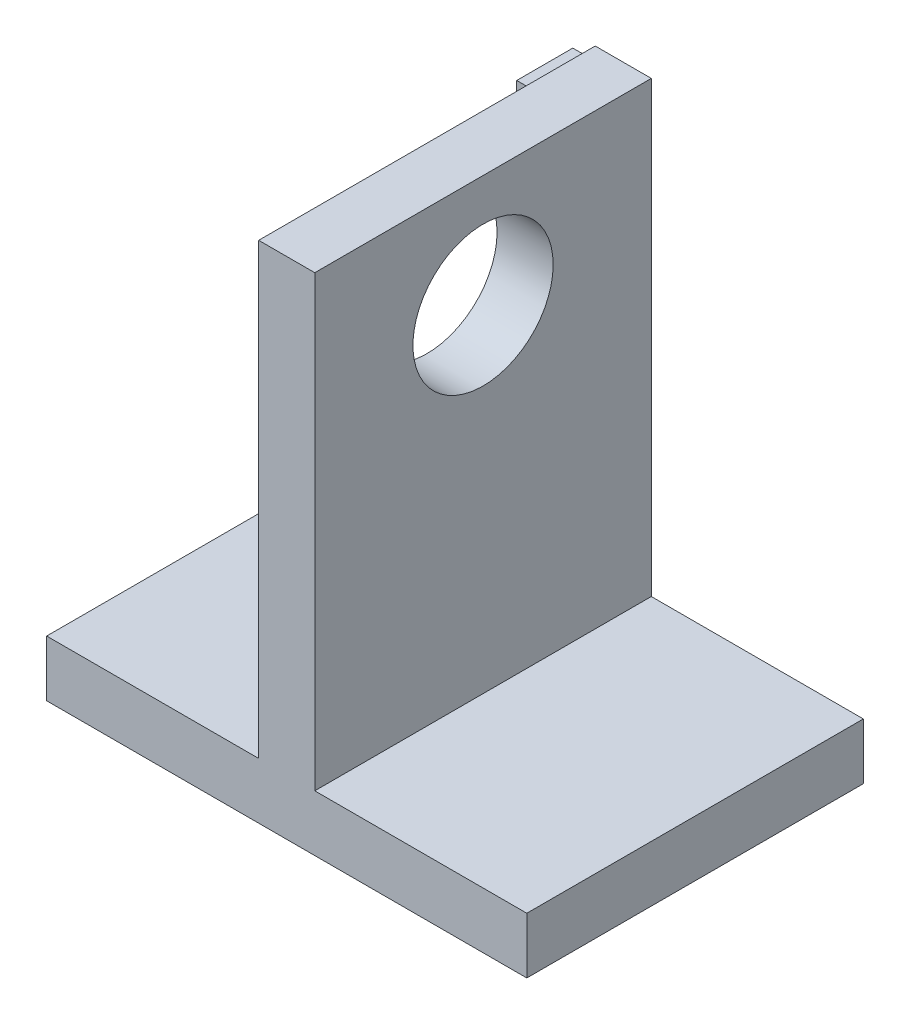
ISO-10303-21;
HEADER;
FILE_DESCRIPTION(('STEP AP214'),'2;1');
FILE_NAME('part.step','',(''),(''),'','','');
FILE_SCHEMA(('AUTOMOTIVE_DESIGN { 1 0 10303 214 1 1 1 1 }'));
ENDSEC;
DATA;
#1=APPLICATION_CONTEXT('core data for automotive mechanical design processes');
#2=APPLICATION_PROTOCOL_DEFINITION('international standard','automotive_design',2000,#1);
#3=PRODUCT_CONTEXT('',#1,'mechanical');
#4=PRODUCT('Part','Part','',(#3));
#5=PRODUCT_RELATED_PRODUCT_CATEGORY('part','',(#4));
#6=PRODUCT_DEFINITION_FORMATION('','',#4);
#7=PRODUCT_DEFINITION_CONTEXT('part definition',#1,'design');
#8=PRODUCT_DEFINITION('design','',#6,#7);
#9=PRODUCT_DEFINITION_SHAPE('','',#8);
#10=(LENGTH_UNIT() NAMED_UNIT(*) SI_UNIT(.MILLI.,.METRE.));
#11=(NAMED_UNIT(*) PLANE_ANGLE_UNIT() SI_UNIT($,.RADIAN.));
#12=(NAMED_UNIT(*) SI_UNIT($,.STERADIAN.) SOLID_ANGLE_UNIT());
#13=UNCERTAINTY_MEASURE_WITH_UNIT(LENGTH_MEASURE(1.E-05),#10,'distance_accuracy_value','');
#14=(GEOMETRIC_REPRESENTATION_CONTEXT(3) GLOBAL_UNCERTAINTY_ASSIGNED_CONTEXT((#13)) GLOBAL_UNIT_ASSIGNED_CONTEXT((#10,
#11,#12)) REPRESENTATION_CONTEXT('',''));
#15=CARTESIAN_POINT('',(0.,0.,0.));
#16=DIRECTION('',(0.,0.,1.));
#17=DIRECTION('',(1.,0.,0.));
#18=AXIS2_PLACEMENT_3D('',#15,#16,#17);
#19=CARTESIAN_POINT('',(-1.39700000000001,3.175,19.05));
#20=DIRECTION('',(-1.,0.,0.));
#21=DIRECTION('',(0.,0.,1.));
#22=AXIS2_PLACEMENT_3D('',#19,#20,#21);
#23=PLANE('',#22);
#24=CARTESIAN_POINT('',(-1.39700000000001,41.275,0.));
#25=DIRECTION('',(-1.,0.,0.));
#26=DIRECTION('',(0.,0.,1.));
#27=AXIS2_PLACEMENT_3D('',#24,#25,#26);
#28=CIRCLE('',#27,7.9375);
#29=CARTESIAN_POINT('',(-1.39700000000001,41.275,-7.9375));
#30=VERTEX_POINT('',#29);
#31=EDGE_CURVE('E206',#30,#30,#28,.T.);
#32=ORIENTED_EDGE('',*,*,#31,.F.);
#33=EDGE_LOOP('',(#32));
#34=FACE_BOUND('',#33,.T.);
#35=DIRECTION('',(0.,-1.,0.));
#36=VECTOR('',#35,1.);
#37=CARTESIAN_POINT('',(-1.39700000000001,0.,-12.7));
#38=LINE('',#37,#36);
#39=CARTESIAN_POINT('',(-1.39700000000001,52.5018,-12.7));
#40=VERTEX_POINT('',#39);
#41=CARTESIAN_POINT('',(-1.39700000000001,33.8582,-12.7));
#42=VERTEX_POINT('',#41);
#43=EDGE_CURVE('E157',#40,#42,#38,.T.);
#44=ORIENTED_EDGE('',*,*,#43,.T.);
#45=DIRECTION('',(0.,0.,-1.));
#46=VECTOR('',#45,1.);
#47=CARTESIAN_POINT('',(-1.39700000000001,33.8582,-19.05));
#48=LINE('',#47,#46);
#49=CARTESIAN_POINT('',(-1.39700000000001,33.8582,-19.05));
#50=VERTEX_POINT('',#49);
#51=EDGE_CURVE('E260',#42,#50,#48,.T.);
#52=ORIENTED_EDGE('',*,*,#51,.T.);
#53=DIRECTION('',(0.,1.,0.));
#54=VECTOR('',#53,1.);
#55=CARTESIAN_POINT('',(-1.39700000000001,3.175,-19.05));
#56=LINE('',#55,#54);
#57=CARTESIAN_POINT('',(-1.39700000000001,3.175,-19.05));
#58=VERTEX_POINT('',#57);
#59=EDGE_CURVE('E214',#58,#50,#56,.T.);
#60=ORIENTED_EDGE('',*,*,#59,.F.);
#61=DIRECTION('',(0.,0.,-1.));
#62=VECTOR('',#61,1.);
#63=CARTESIAN_POINT('',(-1.39700000000001,3.175,19.05));
#64=LINE('',#63,#62);
#65=CARTESIAN_POINT('',(-1.39700000000001,3.175,19.05));
#66=VERTEX_POINT('',#65);
#67=EDGE_CURVE('E261',#66,#58,#64,.T.);
#68=ORIENTED_EDGE('',*,*,#67,.F.);
#69=DIRECTION('',(0.,1.,0.));
#70=VECTOR('',#69,1.);
#71=CARTESIAN_POINT('',(-1.39700000000001,3.175,19.05));
#72=LINE('',#71,#70);
#73=CARTESIAN_POINT('',(-1.39700000000001,53.975,19.05));
#74=VERTEX_POINT('',#73);
#75=EDGE_CURVE('E232',#66,#74,#72,.T.);
#76=ORIENTED_EDGE('',*,*,#75,.T.);
#77=DIRECTION('',(0.,0.,-1.));
#78=VECTOR('',#77,1.);
#79=CARTESIAN_POINT('',(-1.39700000000001,53.975,19.05));
#80=LINE('',#79,#78);
#81=CARTESIAN_POINT('',(-1.39700000000001,53.975,-19.05));
#82=VERTEX_POINT('',#81);
#83=EDGE_CURVE('E257',#74,#82,#80,.T.);
#84=ORIENTED_EDGE('',*,*,#83,.T.);
#85=CARTESIAN_POINT('',(-1.39700000000001,52.5018,-19.05));
#86=VERTEX_POINT('',#85);
#87=EDGE_CURVE('E255',#86,#82,#56,.T.);
#88=ORIENTED_EDGE('',*,*,#87,.F.);
#89=DIRECTION('',(0.,0.,1.));
#90=VECTOR('',#89,1.);
#91=CARTESIAN_POINT('',(-1.39700000000001,52.5018,0.));
#92=LINE('',#91,#90);
#93=EDGE_CURVE('E186',#86,#40,#92,.T.);
#94=ORIENTED_EDGE('',*,*,#93,.T.);
#95=EDGE_LOOP('',(#44,#52,#60,#68,#76,#84,#88,#94));
#96=FACE_BOUND('',#95,.T.);
#97=ADVANCED_FACE('F35',(#34,#96),#23,.T.);
#98=CARTESIAN_POINT('',(-1.39700000000001,53.975,19.05));
#99=DIRECTION('',(0.,1.,0.));
#100=DIRECTION('',(0.,0.,1.));
#101=AXIS2_PLACEMENT_3D('',#98,#99,#100);
#102=PLANE('',#101);
#103=DIRECTION('',(1.,0.,0.));
#104=VECTOR('',#103,1.);
#105=CARTESIAN_POINT('',(-1.39700000000001,53.975,-19.05));
#106=LINE('',#105,#104);
#107=CARTESIAN_POINT('',(4.95299999999999,53.975,-19.05));
#108=VERTEX_POINT('',#107);
#109=EDGE_CURVE('E209',#82,#108,#106,.T.);
#110=ORIENTED_EDGE('',*,*,#109,.F.);
#111=ORIENTED_EDGE('',*,*,#83,.F.);
#112=DIRECTION('',(1.,0.,0.));
#113=VECTOR('',#112,1.);
#114=CARTESIAN_POINT('',(-1.39700000000001,53.975,19.05));
#115=LINE('',#114,#113);
#116=CARTESIAN_POINT('',(4.95299999999999,53.975,19.05));
#117=VERTEX_POINT('',#116);
#118=EDGE_CURVE('E210',#74,#117,#115,.T.);
#119=ORIENTED_EDGE('',*,*,#118,.T.);
#120=DIRECTION('',(0.,0.,-1.));
#121=VECTOR('',#120,1.);
#122=CARTESIAN_POINT('',(4.95299999999999,53.975,19.05));
#123=LINE('',#122,#121);
#124=EDGE_CURVE('E235',#117,#108,#123,.T.);
#125=ORIENTED_EDGE('',*,*,#124,.T.);
#126=EDGE_LOOP('',(#110,#111,#119,#125));
#127=FACE_BOUND('',#126,.T.);
#128=ADVANCED_FACE('F299',(#127),#102,.T.);
#129=CARTESIAN_POINT('',(-25.4,3.17499999999999,19.05));
#130=DIRECTION('',(0.,1.,0.));
#131=DIRECTION('',(-1.,0.,0.));
#132=AXIS2_PLACEMENT_3D('',#129,#130,#131);
#133=PLANE('',#132);
#134=DIRECTION('',(1.,0.,0.));
#135=VECTOR('',#134,1.);
#136=CARTESIAN_POINT('',(-25.4,3.17499999999999,-19.05));
#137=LINE('',#136,#135);
#138=CARTESIAN_POINT('',(-25.4,3.17499999999999,-19.05));
#139=VERTEX_POINT('',#138);
#140=EDGE_CURVE('E252',#139,#58,#137,.T.);
#141=ORIENTED_EDGE('',*,*,#140,.F.);
#142=DIRECTION('',(0.,0.,-1.));
#143=VECTOR('',#142,1.);
#144=CARTESIAN_POINT('',(-25.4,3.17499999999999,19.05));
#145=LINE('',#144,#143);
#146=CARTESIAN_POINT('',(-25.4,3.17499999999999,19.05));
#147=VERTEX_POINT('',#146);
#148=EDGE_CURVE('E263',#147,#139,#145,.T.);
#149=ORIENTED_EDGE('',*,*,#148,.F.);
#150=DIRECTION('',(1.,0.,0.));
#151=VECTOR('',#150,1.);
#152=CARTESIAN_POINT('',(-25.4,3.17499999999999,19.05));
#153=LINE('',#152,#151);
#154=EDGE_CURVE('E229',#147,#66,#153,.T.);
#155=ORIENTED_EDGE('',*,*,#154,.T.);
#156=ORIENTED_EDGE('',*,*,#67,.T.);
#157=EDGE_LOOP('',(#141,#149,#155,#156));
#158=FACE_BOUND('',#157,.T.);
#159=ADVANCED_FACE('F287',(#158),#133,.T.);
#160=CARTESIAN_POINT('',(-25.4,-3.17500000000001,19.05));
#161=DIRECTION('',(-1.,0.,0.));
#162=DIRECTION('',(0.,-1.,0.));
#163=AXIS2_PLACEMENT_3D('',#160,#161,#162);
#164=PLANE('',#163);
#165=DIRECTION('',(0.,1.,0.));
#166=VECTOR('',#165,1.);
#167=CARTESIAN_POINT('',(-25.4,-3.17500000000001,-19.05));
#168=LINE('',#167,#166);
#169=CARTESIAN_POINT('',(-25.4,-3.17500000000001,-19.05));
#170=VERTEX_POINT('',#169);
#171=EDGE_CURVE('E249',#170,#139,#168,.T.);
#172=ORIENTED_EDGE('',*,*,#171,.F.);
#173=DIRECTION('',(0.,0.,-1.));
#174=VECTOR('',#173,1.);
#175=CARTESIAN_POINT('',(-25.4,-3.17500000000001,19.05));
#176=LINE('',#175,#174);
#177=CARTESIAN_POINT('',(-25.4,-3.17500000000001,19.05));
#178=VERTEX_POINT('',#177);
#179=EDGE_CURVE('E265',#178,#170,#176,.T.);
#180=ORIENTED_EDGE('',*,*,#179,.F.);
#181=DIRECTION('',(0.,1.,0.));
#182=VECTOR('',#181,1.);
#183=CARTESIAN_POINT('',(-25.4,-3.17500000000001,19.05));
#184=LINE('',#183,#182);
#185=EDGE_CURVE('E226',#178,#147,#184,.T.);
#186=ORIENTED_EDGE('',*,*,#185,.T.);
#187=ORIENTED_EDGE('',*,*,#148,.T.);
#188=EDGE_LOOP('',(#172,#180,#186,#187));
#189=FACE_BOUND('',#188,.T.);
#190=ADVANCED_FACE('F334',(#189),#164,.T.);
#191=CARTESIAN_POINT('',(28.956,-3.175,19.05));
#192=DIRECTION('',(0.,-1.,0.));
#193=DIRECTION('',(1.,0.,0.));
#194=AXIS2_PLACEMENT_3D('',#191,#192,#193);
#195=PLANE('',#194);
#196=DIRECTION('',(-1.,0.,0.));
#197=VECTOR('',#196,1.);
#198=CARTESIAN_POINT('',(28.956,-3.175,-19.05));
#199=LINE('',#198,#197);
#200=CARTESIAN_POINT('',(28.956,-3.175,-19.05));
#201=VERTEX_POINT('',#200);
#202=EDGE_CURVE('E246',#201,#170,#199,.T.);
#203=ORIENTED_EDGE('',*,*,#202,.F.);
#204=DIRECTION('',(0.,0.,-1.));
#205=VECTOR('',#204,1.);
#206=CARTESIAN_POINT('',(28.956,-3.175,19.05));
#207=LINE('',#206,#205);
#208=CARTESIAN_POINT('',(28.956,-3.175,19.05));
#209=VERTEX_POINT('',#208);
#210=EDGE_CURVE('E267',#209,#201,#207,.T.);
#211=ORIENTED_EDGE('',*,*,#210,.F.);
#212=DIRECTION('',(-1.,0.,0.));
#213=VECTOR('',#212,1.);
#214=CARTESIAN_POINT('',(28.956,-3.175,19.05));
#215=LINE('',#214,#213);
#216=EDGE_CURVE('E223',#209,#178,#215,.T.);
#217=ORIENTED_EDGE('',*,*,#216,.T.);
#218=ORIENTED_EDGE('',*,*,#179,.T.);
#219=EDGE_LOOP('',(#203,#211,#217,#218));
#220=FACE_BOUND('',#219,.T.);
#221=ADVANCED_FACE('F337',(#220),#195,.T.);
#222=CARTESIAN_POINT('',(28.956,3.175,19.05));
#223=DIRECTION('',(1.,0.,0.));
#224=DIRECTION('',(0.,0.,-1.));
#225=AXIS2_PLACEMENT_3D('',#222,#223,#224);
#226=PLANE('',#225);
#227=DIRECTION('',(0.,-1.,0.));
#228=VECTOR('',#227,1.);
#229=CARTESIAN_POINT('',(28.956,3.175,-19.05));
#230=LINE('',#229,#228);
#231=CARTESIAN_POINT('',(28.956,3.175,-19.05));
#232=VERTEX_POINT('',#231);
#233=EDGE_CURVE('E243',#232,#201,#230,.T.);
#234=ORIENTED_EDGE('',*,*,#233,.F.);
#235=DIRECTION('',(0.,0.,-1.));
#236=VECTOR('',#235,1.);
#237=CARTESIAN_POINT('',(28.956,3.175,19.05));
#238=LINE('',#237,#236);
#239=CARTESIAN_POINT('',(28.956,3.175,19.05));
#240=VERTEX_POINT('',#239);
#241=EDGE_CURVE('E269',#240,#232,#238,.T.);
#242=ORIENTED_EDGE('',*,*,#241,.F.);
#243=DIRECTION('',(0.,-1.,0.));
#244=VECTOR('',#243,1.);
#245=CARTESIAN_POINT('',(28.956,3.175,19.05));
#246=LINE('',#245,#244);
#247=EDGE_CURVE('E220',#240,#209,#246,.T.);
#248=ORIENTED_EDGE('',*,*,#247,.T.);
#249=ORIENTED_EDGE('',*,*,#210,.T.);
#250=EDGE_LOOP('',(#234,#242,#248,#249));
#251=FACE_BOUND('',#250,.T.);
#252=ADVANCED_FACE('F341',(#251),#226,.T.);
#253=CARTESIAN_POINT('',(4.953,3.175,19.05));
#254=DIRECTION('',(0.,1.,0.));
#255=DIRECTION('',(0.,0.,1.));
#256=AXIS2_PLACEMENT_3D('',#253,#254,#255);
#257=PLANE('',#256);
#258=DIRECTION('',(1.,0.,0.));
#259=VECTOR('',#258,1.);
#260=CARTESIAN_POINT('',(4.953,3.175,-19.05));
#261=LINE('',#260,#259);
#262=CARTESIAN_POINT('',(4.953,3.175,-19.05));
#263=VERTEX_POINT('',#262);
#264=EDGE_CURVE('E240',#263,#232,#261,.T.);
#265=ORIENTED_EDGE('',*,*,#264,.F.);
#266=DIRECTION('',(0.,0.,-1.));
#267=VECTOR('',#266,1.);
#268=CARTESIAN_POINT('',(4.953,3.175,19.05));
#269=LINE('',#268,#267);
#270=CARTESIAN_POINT('',(4.953,3.175,19.05));
#271=VERTEX_POINT('',#270);
#272=EDGE_CURVE('E271',#271,#263,#269,.T.);
#273=ORIENTED_EDGE('',*,*,#272,.F.);
#274=DIRECTION('',(1.,0.,0.));
#275=VECTOR('',#274,1.);
#276=CARTESIAN_POINT('',(4.953,3.175,19.05));
#277=LINE('',#276,#275);
#278=EDGE_CURVE('E217',#271,#240,#277,.T.);
#279=ORIENTED_EDGE('',*,*,#278,.T.);
#280=ORIENTED_EDGE('',*,*,#241,.T.);
#281=EDGE_LOOP('',(#265,#273,#279,#280));
#282=FACE_BOUND('',#281,.T.);
#283=ADVANCED_FACE('F345',(#282),#257,.T.);
#284=CARTESIAN_POINT('',(4.95299999999999,53.975,19.05));
#285=DIRECTION('',(1.,0.,0.));
#286=DIRECTION('',(0.,1.,0.));
#287=AXIS2_PLACEMENT_3D('',#284,#285,#286);
#288=PLANE('',#287);
#289=CARTESIAN_POINT('',(4.953,41.275,0.));
#290=DIRECTION('',(1.,0.,0.));
#291=DIRECTION('',(0.,1.,0.));
#292=AXIS2_PLACEMENT_3D('',#289,#290,#291);
#293=CIRCLE('',#292,7.9375);
#294=CARTESIAN_POINT('',(4.953,41.275,-7.9375));
#295=VERTEX_POINT('',#294);
#296=EDGE_CURVE('E205',#295,#295,#293,.T.);
#297=ORIENTED_EDGE('',*,*,#296,.F.);
#298=EDGE_LOOP('',(#297));
#299=FACE_BOUND('',#298,.T.);
#300=DIRECTION('',(0.,-1.,0.));
#301=VECTOR('',#300,1.);
#302=CARTESIAN_POINT('',(4.95299999999999,53.975,-19.05));
#303=LINE('',#302,#301);
#304=EDGE_CURVE('E237',#108,#263,#303,.T.);
#305=ORIENTED_EDGE('',*,*,#304,.F.);
#306=ORIENTED_EDGE('',*,*,#124,.F.);
#307=DIRECTION('',(0.,-1.,0.));
#308=VECTOR('',#307,1.);
#309=CARTESIAN_POINT('',(4.95299999999999,53.975,19.05));
#310=LINE('',#309,#308);
#311=EDGE_CURVE('E213',#117,#271,#310,.T.);
#312=ORIENTED_EDGE('',*,*,#311,.T.);
#313=ORIENTED_EDGE('',*,*,#272,.T.);
#314=EDGE_LOOP('',(#305,#306,#312,#313));
#315=FACE_BOUND('',#314,.T.);
#316=ADVANCED_FACE('F349',(#299,#315),#288,.T.);
#317=CARTESIAN_POINT('',(0.,0.,19.05));
#318=DIRECTION('',(0.,0.,-1.));
#319=DIRECTION('',(-1.,0.,0.));
#320=AXIS2_PLACEMENT_3D('',#317,#318,#319);
#321=PLANE('',#320);
#322=ORIENTED_EDGE('',*,*,#118,.F.);
#323=ORIENTED_EDGE('',*,*,#75,.F.);
#324=ORIENTED_EDGE('',*,*,#154,.F.);
#325=ORIENTED_EDGE('',*,*,#185,.F.);
#326=ORIENTED_EDGE('',*,*,#216,.F.);
#327=ORIENTED_EDGE('',*,*,#247,.F.);
#328=ORIENTED_EDGE('',*,*,#278,.F.);
#329=ORIENTED_EDGE('',*,*,#311,.F.);
#330=EDGE_LOOP('',(#322,#323,#324,#325,#326,#327,#328,#329));
#331=FACE_BOUND('',#330,.T.);
#332=ADVANCED_FACE('F294',(#331),#321,.F.);
#333=CARTESIAN_POINT('',(0.,0.,-19.05));
#334=DIRECTION('',(0.,0.,-1.));
#335=DIRECTION('',(-1.,0.,0.));
#336=AXIS2_PLACEMENT_3D('',#333,#334,#335);
#337=PLANE('',#336);
#338=ORIENTED_EDGE('',*,*,#109,.T.);
#339=ORIENTED_EDGE('',*,*,#304,.T.);
#340=ORIENTED_EDGE('',*,*,#264,.T.);
#341=ORIENTED_EDGE('',*,*,#233,.T.);
#342=ORIENTED_EDGE('',*,*,#202,.T.);
#343=ORIENTED_EDGE('',*,*,#171,.T.);
#344=ORIENTED_EDGE('',*,*,#140,.T.);
#345=ORIENTED_EDGE('',*,*,#59,.T.);
#346=CARTESIAN_POINT('',(-7.747,33.8582,-19.05));
#347=DIRECTION('',(0.,0.,-1.));
#348=DIRECTION('',(-1.,0.,0.));
#349=AXIS2_PLACEMENT_3D('',#346,#347,#348);
#350=CIRCLE('',#349,6.35);
#351=CARTESIAN_POINT('',(-3.93700000000001,38.9382,-19.05));
#352=VERTEX_POINT('',#351);
#353=EDGE_CURVE('E11',#50,#352,#350,.F.);
#354=ORIENTED_EDGE('',*,*,#353,.T.);
#355=DIRECTION('',(0.,-1.,0.));
#356=VECTOR('',#355,1.);
#357=CARTESIAN_POINT('',(-3.93700000000001,0.,-19.05));
#358=LINE('',#357,#356);
#359=CARTESIAN_POINT('',(-3.93700000000001,45.2882,-19.05));
#360=VERTEX_POINT('',#359);
#361=EDGE_CURVE('E161',#360,#352,#358,.T.);
#362=ORIENTED_EDGE('',*,*,#361,.F.);
#363=DIRECTION('',(1.,0.,0.));
#364=VECTOR('',#363,1.);
#365=CARTESIAN_POINT('',(-3.93700000000001,45.2882,-19.05));
#366=LINE('',#365,#364);
#367=CARTESIAN_POINT('',(-2.41300000000001,45.2882,-19.05));
#368=VERTEX_POINT('',#367);
#369=EDGE_CURVE('E146',#360,#368,#366,.T.);
#370=ORIENTED_EDGE('',*,*,#369,.T.);
#371=DIRECTION('',(0.,-1.,0.));
#372=VECTOR('',#371,1.);
#373=CARTESIAN_POINT('',(-2.41300000000001,46.1518,-19.05));
#374=LINE('',#373,#372);
#375=CARTESIAN_POINT('',(-2.41300000000001,46.1518,-19.05));
#376=VERTEX_POINT('',#375);
#377=EDGE_CURVE('E313',#376,#368,#374,.T.);
#378=ORIENTED_EDGE('',*,*,#377,.F.);
#379=DIRECTION('',(1.,0.,0.));
#380=VECTOR('',#379,1.);
#381=CARTESIAN_POINT('',(-3.93700000000001,46.1518,-19.05));
#382=LINE('',#381,#380);
#383=CARTESIAN_POINT('',(-3.93700000000001,46.1518,-19.05));
#384=VERTEX_POINT('',#383);
#385=EDGE_CURVE('E50',#384,#376,#382,.T.);
#386=ORIENTED_EDGE('',*,*,#385,.F.);
#387=DIRECTION('',(0.,-1.,0.));
#388=VECTOR('',#387,1.);
#389=CARTESIAN_POINT('',(-3.93700000000001,0.,-19.05));
#390=LINE('',#389,#388);
#391=CARTESIAN_POINT('',(-3.93700000000001,52.5018,-19.05));
#392=VERTEX_POINT('',#391);
#393=EDGE_CURVE('E182',#392,#384,#390,.T.);
#394=ORIENTED_EDGE('',*,*,#393,.F.);
#395=DIRECTION('',(1.,0.,0.));
#396=VECTOR('',#395,1.);
#397=CARTESIAN_POINT('',(-3.93700000000001,52.5018,-19.05));
#398=LINE('',#397,#396);
#399=EDGE_CURVE('E194',#392,#86,#398,.T.);
#400=ORIENTED_EDGE('',*,*,#399,.T.);
#401=ORIENTED_EDGE('',*,*,#87,.T.);
#402=EDGE_LOOP('',(#338,#339,#340,#341,#342,#343,#344,#345,#354,#362,#370,#378,#386,#394,#400,#401));
#403=FACE_BOUND('',#402,.T.);
#404=ADVANCED_FACE('F163',(#403),#337,.T.);
#405=CARTESIAN_POINT('',(-25.4,41.275,0.));
#406=DIRECTION('',(1.,0.,0.));
#407=DIRECTION('',(0.,0.,-1.));
#408=AXIS2_PLACEMENT_3D('',#405,#406,#407);
#409=CYLINDRICAL_SURFACE('',#408,7.9375);
#410=CARTESIAN_POINT('',(-1.39700000000001,41.275,-7.9375));
#411=CARTESIAN_POINT('',(-1.33085416666667,41.275,-7.9375));
#412=CARTESIAN_POINT('',(-1.26470833333334,41.275,-7.9375));
#413=CARTESIAN_POINT('',(-1.13241666666667,41.275,-7.9375));
#414=CARTESIAN_POINT('',(-1.06627083333334,41.275,-7.9375));
#415=CARTESIAN_POINT('',(-0.933979166666671,41.275,-7.9375));
#416=CARTESIAN_POINT('',(-0.867833333333339,41.275,-7.9375));
#417=CARTESIAN_POINT('',(-0.735541666666673,41.275,-7.9375));
#418=CARTESIAN_POINT('',(-0.66939583333334,41.275,-7.9375));
#419=CARTESIAN_POINT('',(-0.537104166666672,41.275,-7.9375));
#420=CARTESIAN_POINT('',(-0.470958333333338,41.275,-7.9375));
#421=CARTESIAN_POINT('',(-0.338666666666671,41.275,-7.9375));
#422=CARTESIAN_POINT('',(-0.272520833333338,41.275,-7.9375));
#423=CARTESIAN_POINT('',(-0.140229166666672,41.275,-7.9375));
#424=CARTESIAN_POINT('',(-0.0740833333333392,41.275,-7.9375));
#425=CARTESIAN_POINT('',(0.0582083333333268,41.275,-7.9375));
#426=CARTESIAN_POINT('',(0.12435416666666,41.275,-7.9375));
#427=CARTESIAN_POINT('',(0.256645833333327,41.275,-7.9375));
#428=CARTESIAN_POINT('',(0.322791666666661,41.275,-7.9375));
#429=CARTESIAN_POINT('',(0.455083333333328,41.275,-7.9375));
#430=CARTESIAN_POINT('',(0.521229166666661,41.275,-7.9375));
#431=CARTESIAN_POINT('',(0.653520833333327,41.275,-7.9375));
#432=CARTESIAN_POINT('',(0.71966666666666,41.275,-7.9375));
#433=CARTESIAN_POINT('',(0.851958333333327,41.275,-7.9375));
#434=CARTESIAN_POINT('',(0.918104166666662,41.275,-7.9375));
#435=CARTESIAN_POINT('',(1.05039583333333,41.275,-7.9375));
#436=CARTESIAN_POINT('',(1.11654166666666,41.275,-7.9375));
#437=CARTESIAN_POINT('',(1.24883333333333,41.275,-7.9375));
#438=CARTESIAN_POINT('',(1.31497916666666,41.275,-7.9375));
#439=CARTESIAN_POINT('',(1.44727083333333,41.275,-7.9375));
#440=CARTESIAN_POINT('',(1.51341666666666,41.275,-7.9375));
#441=CARTESIAN_POINT('',(1.64570833333333,41.275,-7.9375));
#442=CARTESIAN_POINT('',(1.71185416666666,41.275,-7.9375));
#443=CARTESIAN_POINT('',(1.84414583333333,41.275,-7.9375));
#444=CARTESIAN_POINT('',(1.91029166666666,41.275,-7.9375));
#445=CARTESIAN_POINT('',(2.04258333333333,41.275,-7.9375));
#446=CARTESIAN_POINT('',(2.10872916666666,41.275,-7.9375));
#447=CARTESIAN_POINT('',(2.24102083333333,41.275,-7.9375));
#448=CARTESIAN_POINT('',(2.30716666666666,41.275,-7.9375));
#449=CARTESIAN_POINT('',(2.43945833333333,41.275,-7.9375));
#450=CARTESIAN_POINT('',(2.50560416666666,41.275,-7.9375));
#451=CARTESIAN_POINT('',(2.63789583333333,41.275,-7.9375));
#452=CARTESIAN_POINT('',(2.70404166666666,41.275,-7.9375));
#453=CARTESIAN_POINT('',(2.83633333333333,41.275,-7.9375));
#454=CARTESIAN_POINT('',(2.90247916666666,41.275,-7.9375));
#455=CARTESIAN_POINT('',(3.03477083333333,41.275,-7.9375));
#456=CARTESIAN_POINT('',(3.10091666666666,41.275,-7.9375));
#457=CARTESIAN_POINT('',(3.23320833333333,41.275,-7.9375));
#458=CARTESIAN_POINT('',(3.29935416666666,41.275,-7.9375));
#459=CARTESIAN_POINT('',(3.43164583333333,41.275,-7.9375));
#460=CARTESIAN_POINT('',(3.49779166666666,41.275,-7.9375));
#461=CARTESIAN_POINT('',(3.63008333333333,41.275,-7.9375));
#462=CARTESIAN_POINT('',(3.69622916666666,41.275,-7.9375));
#463=CARTESIAN_POINT('',(3.82852083333333,41.275,-7.9375));
#464=CARTESIAN_POINT('',(3.89466666666666,41.275,-7.9375));
#465=CARTESIAN_POINT('',(4.02695833333333,41.275,-7.9375));
#466=CARTESIAN_POINT('',(4.09310416666666,41.275,-7.9375));
#467=CARTESIAN_POINT('',(4.22539583333333,41.275,-7.9375));
#468=CARTESIAN_POINT('',(4.29154166666666,41.275,-7.9375));
#469=CARTESIAN_POINT('',(4.42383333333333,41.275,-7.9375));
#470=CARTESIAN_POINT('',(4.48997916666666,41.275,-7.9375));
#471=CARTESIAN_POINT('',(4.62227083333333,41.275,-7.9375));
#472=CARTESIAN_POINT('',(4.68841666666666,41.275,-7.9375));
#473=CARTESIAN_POINT('',(4.82070833333333,41.275,-7.9375));
#474=CARTESIAN_POINT('',(4.88685416666666,41.275,-7.9375));
#475=CARTESIAN_POINT('',(4.953,41.275,-7.9375));
#476=B_SPLINE_CURVE_WITH_KNOTS('',3,(#410,#411,#412,#413,#414,#415,#416,#417,#418,#419,#420,
#421,#422,#423,#424,#425,#426,#427,#428,#429,#430,#431,#432,#433,#434,#435,#436,#437,#438,#439,
#440,#441,#442,#443,#444,#445,#446,#447,#448,#449,#450,#451,#452,#453,#454,#455,#456,#457,#458,
#459,#460,#461,#462,#463,#464,#465,#466,#467,#468,#469,#470,#471,#472,#473,#474,#475),
.UNSPECIFIED.,.F.,.F.,(4,2,2,2,2,2,2,2,2,2,2,2,2,2,2,2,2,2,2,2,2,2,2,2,2,2,2,2,2,2,2,2,4),(0.,
0.198437499999999,0.396875000000001,0.5953125,0.793749999999999,0.992187500000002,1.190625,
1.3890625,1.5875,1.7859375,1.984375,2.1828125,2.38125,2.5796875,2.778125,2.9765625,3.175,
3.3734375,3.571875,3.7703125,3.96875,4.1671875,4.365625,4.5640625,4.7625,4.9609375,5.159375,
5.3578125,5.55625,5.7546875,5.953125,6.1515625,6.35),.UNSPECIFIED.);
#477=EDGE_CURVE('BSEAM364',#30,#295,#476,.T.);
#478=ORIENTED_EDGE('',*,*,#31,.T.);
#479=ORIENTED_EDGE('',*,*,#296,.T.);
#480=ORIENTED_EDGE('',*,*,#477,.T.);
#481=ORIENTED_EDGE('',*,*,#477,.F.);
#482=EDGE_LOOP('',(#478,#480,#479,#481));
#483=FACE_BOUND('',#482,.T.);
#484=ADVANCED_FACE('F364',(#483),#409,.F.);
#485=CARTESIAN_POINT('',(-3.93700000000001,46.1518,0.));
#486=DIRECTION('',(0.,1.,0.));
#487=DIRECTION('',(0.,0.,1.));
#488=AXIS2_PLACEMENT_3D('',#485,#486,#487);
#489=PLANE('',#488);
#490=ORIENTED_EDGE('',*,*,#385,.T.);
#491=DIRECTION('',(0.,0.,-1.));
#492=VECTOR('',#491,1.);
#493=CARTESIAN_POINT('',(-2.41300000000001,46.1518,-19.05));
#494=LINE('',#493,#492);
#495=CARTESIAN_POINT('',(-2.41300000000001,46.1518,-12.7));
#496=VERTEX_POINT('',#495);
#497=EDGE_CURVE('E54',#496,#376,#494,.T.);
#498=ORIENTED_EDGE('',*,*,#497,.F.);
#499=DIRECTION('',(1.,0.,0.));
#500=VECTOR('',#499,1.);
#501=CARTESIAN_POINT('',(-3.93700000000001,46.1518,-12.7));
#502=LINE('',#501,#500);
#503=CARTESIAN_POINT('',(-3.93700000000001,46.1518,-12.7));
#504=VERTEX_POINT('',#503);
#505=EDGE_CURVE('E202',#504,#496,#502,.T.);
#506=ORIENTED_EDGE('',*,*,#505,.F.);
#507=DIRECTION('',(0.,0.,1.));
#508=VECTOR('',#507,1.);
#509=CARTESIAN_POINT('',(-3.93700000000001,46.1518,0.));
#510=LINE('',#509,#508);
#511=EDGE_CURVE('E185',#384,#504,#510,.T.);
#512=ORIENTED_EDGE('',*,*,#511,.F.);
#513=EDGE_LOOP('',(#490,#498,#506,#512));
#514=FACE_BOUND('',#513,.T.);
#515=ADVANCED_FACE('F308',(#514),#489,.F.);
#516=CARTESIAN_POINT('',(-3.93700000000001,0.,-12.7));
#517=DIRECTION('',(0.,0.,1.));
#518=DIRECTION('',(0.,-1.,0.));
#519=AXIS2_PLACEMENT_3D('',#516,#517,#518);
#520=PLANE('',#519);
#521=ORIENTED_EDGE('',*,*,#43,.F.);
#522=DIRECTION('',(1.,0.,0.));
#523=VECTOR('',#522,1.);
#524=CARTESIAN_POINT('',(-3.93700000000001,52.5018,-12.7));
#525=LINE('',#524,#523);
#526=CARTESIAN_POINT('',(-3.93700000000001,52.5018,-12.7));
#527=VERTEX_POINT('',#526);
#528=EDGE_CURVE('E200',#527,#40,#525,.T.);
#529=ORIENTED_EDGE('',*,*,#528,.F.);
#530=DIRECTION('',(0.,-1.,0.));
#531=VECTOR('',#530,1.);
#532=CARTESIAN_POINT('',(-3.93700000000001,0.,-12.7));
#533=LINE('',#532,#531);
#534=EDGE_CURVE('E188',#527,#504,#533,.T.);
#535=ORIENTED_EDGE('',*,*,#534,.T.);
#536=ORIENTED_EDGE('',*,*,#505,.T.);
#537=DIRECTION('',(0.,1.,0.));
#538=VECTOR('',#537,1.);
#539=CARTESIAN_POINT('',(-2.41300000000001,46.1518,-12.7));
#540=LINE('',#539,#538);
#541=CARTESIAN_POINT('',(-2.41300000000001,45.2882,-12.7));
#542=VERTEX_POINT('',#541);
#543=EDGE_CURVE('E175',#542,#496,#540,.T.);
#544=ORIENTED_EDGE('',*,*,#543,.F.);
#545=DIRECTION('',(1.,0.,0.));
#546=VECTOR('',#545,1.);
#547=CARTESIAN_POINT('',(-3.93700000000001,45.2882,-12.7));
#548=LINE('',#547,#546);
#549=CARTESIAN_POINT('',(-3.93700000000001,45.2882,-12.7));
#550=VERTEX_POINT('',#549);
#551=EDGE_CURVE('E158',#550,#542,#548,.T.);
#552=ORIENTED_EDGE('',*,*,#551,.F.);
#553=DIRECTION('',(0.,-1.,0.));
#554=VECTOR('',#553,1.);
#555=CARTESIAN_POINT('',(-3.93700000000001,0.,-12.7));
#556=LINE('',#555,#554);
#557=CARTESIAN_POINT('',(-3.93700000000001,38.9382,-12.7));
#558=VERTEX_POINT('',#557);
#559=EDGE_CURVE('E173',#550,#558,#556,.T.);
#560=ORIENTED_EDGE('',*,*,#559,.T.);
#561=CARTESIAN_POINT('',(-7.747,33.8582,-12.7));
#562=DIRECTION('',(0.,0.,1.));
#563=DIRECTION('',(0.,-1.,0.));
#564=AXIS2_PLACEMENT_3D('',#561,#562,#563);
#565=CIRCLE('',#564,6.35);
#566=EDGE_CURVE('E43',#558,#42,#565,.F.);
#567=ORIENTED_EDGE('',*,*,#566,.T.);
#568=EDGE_LOOP('',(#521,#529,#535,#536,#544,#552,#560,#567));
#569=FACE_BOUND('',#568,.T.);
#570=ADVANCED_FACE('F280',(#569),#520,.T.);
#571=CARTESIAN_POINT('',(-3.93700000000001,52.5018,0.));
#572=DIRECTION('',(0.,1.,0.));
#573=DIRECTION('',(-1.,0.,0.));
#574=AXIS2_PLACEMENT_3D('',#571,#572,#573);
#575=PLANE('',#574);
#576=ORIENTED_EDGE('',*,*,#93,.F.);
#577=ORIENTED_EDGE('',*,*,#399,.F.);
#578=DIRECTION('',(0.,0.,1.));
#579=VECTOR('',#578,1.);
#580=CARTESIAN_POINT('',(-3.93700000000001,52.5018,0.));
#581=LINE('',#580,#579);
#582=EDGE_CURVE('E191',#392,#527,#581,.T.);
#583=ORIENTED_EDGE('',*,*,#582,.T.);
#584=ORIENTED_EDGE('',*,*,#528,.T.);
#585=EDGE_LOOP('',(#576,#577,#583,#584));
#586=FACE_BOUND('',#585,.T.);
#587=ADVANCED_FACE('F303',(#586),#575,.T.);
#588=CARTESIAN_POINT('',(-3.93700000000001,0.,0.));
#589=DIRECTION('',(-1.,0.,0.));
#590=DIRECTION('',(0.,-1.,0.));
#591=AXIS2_PLACEMENT_3D('',#588,#589,#590);
#592=PLANE('',#591);
#593=ORIENTED_EDGE('',*,*,#393,.T.);
#594=ORIENTED_EDGE('',*,*,#511,.T.);
#595=ORIENTED_EDGE('',*,*,#534,.F.);
#596=ORIENTED_EDGE('',*,*,#582,.F.);
#597=EDGE_LOOP('',(#593,#594,#595,#596));
#598=FACE_BOUND('',#597,.T.);
#599=ADVANCED_FACE('F307',(#598),#592,.T.);
#600=CARTESIAN_POINT('',(-3.93700000000001,45.2882,0.));
#601=DIRECTION('',(0.,1.,0.));
#602=DIRECTION('',(-1.,0.,0.));
#603=AXIS2_PLACEMENT_3D('',#600,#601,#602);
#604=PLANE('',#603);
#605=DIRECTION('',(0.,0.,1.));
#606=VECTOR('',#605,1.);
#607=CARTESIAN_POINT('',(-2.41300000000001,45.2882,-19.05));
#608=LINE('',#607,#606);
#609=EDGE_CURVE('E153',#368,#542,#608,.T.);
#610=ORIENTED_EDGE('',*,*,#609,.F.);
#611=ORIENTED_EDGE('',*,*,#369,.F.);
#612=DIRECTION('',(0.,0.,1.));
#613=VECTOR('',#612,1.);
#614=CARTESIAN_POINT('',(-3.93700000000001,45.2882,0.));
#615=LINE('',#614,#613);
#616=EDGE_CURVE('E150',#360,#550,#615,.T.);
#617=ORIENTED_EDGE('',*,*,#616,.T.);
#618=ORIENTED_EDGE('',*,*,#551,.T.);
#619=EDGE_LOOP('',(#610,#611,#617,#618));
#620=FACE_BOUND('',#619,.T.);
#621=ADVANCED_FACE('F148',(#620),#604,.T.);
#622=CARTESIAN_POINT('',(-3.93700000000001,0.,0.));
#623=DIRECTION('',(-1.,0.,0.));
#624=DIRECTION('',(0.,-1.,0.));
#625=AXIS2_PLACEMENT_3D('',#622,#623,#624);
#626=PLANE('',#625);
#627=ORIENTED_EDGE('',*,*,#616,.F.);
#628=ORIENTED_EDGE('',*,*,#361,.T.);
#629=DIRECTION('',(0.,0.,1.));
#630=VECTOR('',#629,1.);
#631=CARTESIAN_POINT('',(-3.93700000000001,38.9382,0.));
#632=LINE('',#631,#630);
#633=EDGE_CURVE('E169',#352,#558,#632,.T.);
#634=ORIENTED_EDGE('',*,*,#633,.T.);
#635=ORIENTED_EDGE('',*,*,#559,.F.);
#636=EDGE_LOOP('',(#627,#628,#634,#635));
#637=FACE_BOUND('',#636,.T.);
#638=ADVANCED_FACE('F171',(#637),#626,.T.);
#639=CARTESIAN_POINT('',(-7.747,33.8582,0.));
#640=DIRECTION('',(0.,0.,1.));
#641=DIRECTION('',(1.,0.,0.));
#642=AXIS2_PLACEMENT_3D('',#639,#640,#641);
#643=CYLINDRICAL_SURFACE('',#642,6.35);
#644=ORIENTED_EDGE('',*,*,#353,.F.);
#645=ORIENTED_EDGE('',*,*,#51,.F.);
#646=ORIENTED_EDGE('',*,*,#566,.F.);
#647=ORIENTED_EDGE('',*,*,#633,.F.);
#648=EDGE_LOOP('',(#644,#645,#646,#647));
#649=FACE_BOUND('',#648,.T.);
#650=ADVANCED_FACE('F37',(#649),#643,.F.);
#651=CARTESIAN_POINT('',(-2.41300000000001,0.,0.));
#652=DIRECTION('',(-1.,0.,0.));
#653=DIRECTION('',(0.,0.,1.));
#654=AXIS2_PLACEMENT_3D('',#651,#652,#653);
#655=PLANE('',#654);
#656=ORIENTED_EDGE('',*,*,#377,.T.);
#657=ORIENTED_EDGE('',*,*,#609,.T.);
#658=ORIENTED_EDGE('',*,*,#543,.T.);
#659=ORIENTED_EDGE('',*,*,#497,.T.);
#660=EDGE_LOOP('',(#656,#657,#658,#659));
#661=FACE_BOUND('',#660,.T.);
#662=ADVANCED_FACE('F312',(#661),#655,.T.);
#663=CLOSED_SHELL('',(#97,#128,#159,#190,#221,#252,#283,#316,#332,#404,#484,#515,#570,#587,#599,
#621,#638,#650,#662));
#664=MANIFOLD_SOLID_BREP('B2',#663);
#665=ADVANCED_BREP_SHAPE_REPRESENTATION('',(#18,#664),#14);
#666=SHAPE_DEFINITION_REPRESENTATION(#9,#665);
ENDSEC;
END-ISO-10303-21;
